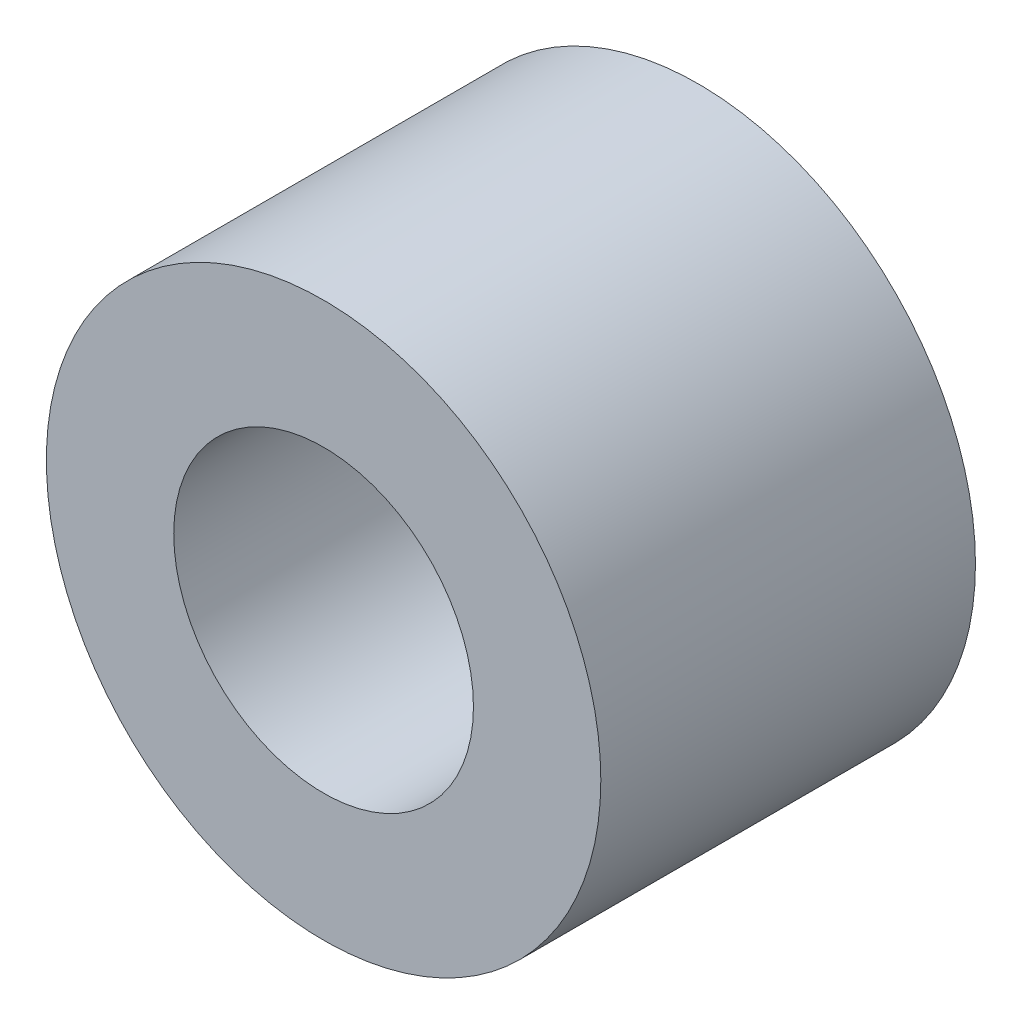
ISO-10303-21;
HEADER;
FILE_DESCRIPTION(('STEP AP214'),'2;1');
FILE_NAME('part.step','',(''),(''),'','','');
FILE_SCHEMA(('AUTOMOTIVE_DESIGN { 1 0 10303 214 1 1 1 1 }'));
ENDSEC;
DATA;
#1=APPLICATION_CONTEXT('core data for automotive mechanical design processes');
#2=APPLICATION_PROTOCOL_DEFINITION('international standard','automotive_design',2000,#1);
#3=PRODUCT_CONTEXT('',#1,'mechanical');
#4=PRODUCT('Part','Part','',(#3));
#5=PRODUCT_RELATED_PRODUCT_CATEGORY('part','',(#4));
#6=PRODUCT_DEFINITION_FORMATION('','',#4);
#7=PRODUCT_DEFINITION_CONTEXT('part definition',#1,'design');
#8=PRODUCT_DEFINITION('design','',#6,#7);
#9=PRODUCT_DEFINITION_SHAPE('','',#8);
#10=(LENGTH_UNIT() NAMED_UNIT(*) SI_UNIT(.MILLI.,.METRE.));
#11=(NAMED_UNIT(*) PLANE_ANGLE_UNIT() SI_UNIT($,.RADIAN.));
#12=(NAMED_UNIT(*) SI_UNIT($,.STERADIAN.) SOLID_ANGLE_UNIT());
#13=UNCERTAINTY_MEASURE_WITH_UNIT(LENGTH_MEASURE(1.E-05),#10,'distance_accuracy_value','');
#14=(GEOMETRIC_REPRESENTATION_CONTEXT(3) GLOBAL_UNCERTAINTY_ASSIGNED_CONTEXT((#13)) GLOBAL_UNIT_ASSIGNED_CONTEXT((#10,
#11,#12)) REPRESENTATION_CONTEXT('',''));
#15=CARTESIAN_POINT('',(0.,0.,0.));
#16=DIRECTION('',(0.,0.,1.));
#17=DIRECTION('',(1.,0.,0.));
#18=AXIS2_PLACEMENT_3D('',#15,#16,#17);
#19=CARTESIAN_POINT('',(0.,0.,2.));
#20=DIRECTION('',(0.,0.,1.));
#21=DIRECTION('',(1.,0.,0.));
#22=AXIS2_PLACEMENT_3D('',#19,#20,#21);
#23=PLANE('',#22);
#24=DIRECTION('',(1.,0.,0.));
#25=VECTOR('',#24,1.);
#26=CARTESIAN_POINT('',(-0.99999999999999,-1.73205080756888,2.));
#27=LINE('',#26,#25);
#28=CARTESIAN_POINT('',(-0.99999999999999,-1.73205080756888,2.));
#29=VERTEX_POINT('',#28);
#30=CARTESIAN_POINT('',(1.00000000000001,-1.73205080756887,2.));
#31=VERTEX_POINT('',#30);
#32=EDGE_CURVE('E111',#29,#31,#27,.T.);
#33=ORIENTED_EDGE('',*,*,#32,.F.);
#34=CARTESIAN_POINT('',(0.,0.,2.));
#35=DIRECTION('',(0.,0.,1.));
#36=DIRECTION('',(1.,0.,0.));
#37=AXIS2_PLACEMENT_3D('',#34,#35,#36);
#38=CIRCLE('',#37,2.);
#39=EDGE_CURVE('E132',#29,#31,#38,.T.);
#40=ORIENTED_EDGE('',*,*,#39,.T.);
#41=EDGE_LOOP('',(#33,#40));
#42=FACE_BOUND('',#41,.T.);
#43=ADVANCED_FACE('F47',(#42),#23,.T.);
#44=DIRECTION('',(0.499999999999995,0.866025403784441,0.));
#45=VECTOR('',#44,1.);
#46=CARTESIAN_POINT('',(1.00000000000001,-1.73205080756887,2.));
#47=LINE('',#46,#45);
#48=CARTESIAN_POINT('',(2.,0.,2.));
#49=VERTEX_POINT('',#48);
#50=EDGE_CURVE('E103',#31,#49,#47,.T.);
#51=ORIENTED_EDGE('',*,*,#50,.F.);
#52=EDGE_CURVE('E124',#31,#49,#38,.T.);
#53=ORIENTED_EDGE('',*,*,#52,.T.);
#54=EDGE_LOOP('',(#51,#53));
#55=FACE_BOUND('',#54,.T.);
#56=ADVANCED_FACE('F123',(#55),#23,.T.);
#57=DIRECTION('',(-0.500000000000005,0.866025403784436,0.));
#58=VECTOR('',#57,1.);
#59=CARTESIAN_POINT('',(2.,0.,2.));
#60=LINE('',#59,#58);
#61=CARTESIAN_POINT('',(0.999999999999989,1.73205080756888,2.));
#62=VERTEX_POINT('',#61);
#63=EDGE_CURVE('E126',#49,#62,#60,.T.);
#64=ORIENTED_EDGE('',*,*,#63,.F.);
#65=EDGE_CURVE('E136',#49,#62,#38,.T.);
#66=ORIENTED_EDGE('',*,*,#65,.T.);
#67=EDGE_LOOP('',(#64,#66));
#68=FACE_BOUND('',#67,.T.);
#69=ADVANCED_FACE('F197',(#68),#23,.T.);
#70=DIRECTION('',(-1.,0.,0.));
#71=VECTOR('',#70,1.);
#72=CARTESIAN_POINT('',(0.999999999999989,1.73205080756888,2.));
#73=LINE('',#72,#71);
#74=CARTESIAN_POINT('',(-1.00000000000001,1.73205080756887,2.));
#75=VERTEX_POINT('',#74);
#76=EDGE_CURVE('E186',#62,#75,#73,.T.);
#77=ORIENTED_EDGE('',*,*,#76,.F.);
#78=EDGE_CURVE('E143',#62,#75,#38,.T.);
#79=ORIENTED_EDGE('',*,*,#78,.T.);
#80=EDGE_LOOP('',(#77,#79));
#81=FACE_BOUND('',#80,.T.);
#82=ADVANCED_FACE('F195',(#81),#23,.T.);
#83=DIRECTION('',(-0.499999999999995,-0.866025403784441,0.));
#84=VECTOR('',#83,1.);
#85=CARTESIAN_POINT('',(-1.00000000000001,1.73205080756887,2.));
#86=LINE('',#85,#84);
#87=CARTESIAN_POINT('',(-2.,0.,2.));
#88=VERTEX_POINT('',#87);
#89=EDGE_CURVE('E62',#75,#88,#86,.T.);
#90=ORIENTED_EDGE('',*,*,#89,.F.);
#91=EDGE_CURVE('E140',#75,#88,#38,.T.);
#92=ORIENTED_EDGE('',*,*,#91,.T.);
#93=EDGE_LOOP('',(#90,#92));
#94=FACE_BOUND('',#93,.T.);
#95=ADVANCED_FACE('F193',(#94),#23,.T.);
#96=CARTESIAN_POINT('',(0.,0.,5.));
#97=DIRECTION('',(0.,0.,-1.));
#98=DIRECTION('',(-1.,0.,0.));
#99=AXIS2_PLACEMENT_3D('',#96,#97,#98);
#100=CYLINDRICAL_SURFACE('',#99,3.7);
#101=CARTESIAN_POINT('',(0.,0.,5.));
#102=DIRECTION('',(0.,0.,1.));
#103=DIRECTION('',(1.,0.,0.));
#104=AXIS2_PLACEMENT_3D('',#101,#102,#103);
#105=CIRCLE('',#104,3.7);
#106=CARTESIAN_POINT('',(3.7,0.,5.));
#107=VERTEX_POINT('',#106);
#108=EDGE_CURVE('E147',#107,#107,#105,.T.);
#109=ORIENTED_EDGE('',*,*,#108,.F.);
#110=EDGE_LOOP('',(#109));
#111=FACE_BOUND('',#110,.T.);
#112=CARTESIAN_POINT('',(0.,0.,0.));
#113=DIRECTION('',(0.,0.,1.));
#114=DIRECTION('',(1.,0.,0.));
#115=AXIS2_PLACEMENT_3D('',#112,#113,#114);
#116=CIRCLE('',#115,3.7);
#117=CARTESIAN_POINT('',(3.7,0.,0.));
#118=VERTEX_POINT('',#117);
#119=EDGE_CURVE('E142',#118,#118,#116,.T.);
#120=ORIENTED_EDGE('',*,*,#119,.T.);
#121=EDGE_LOOP('',(#120));
#122=FACE_BOUND('',#121,.T.);
#123=ADVANCED_FACE('F49',(#111,#122),#100,.T.);
#124=CARTESIAN_POINT('',(0.,0.,5.));
#125=DIRECTION('',(0.,0.,1.));
#126=DIRECTION('',(1.,0.,0.));
#127=AXIS2_PLACEMENT_3D('',#124,#125,#126);
#128=PLANE('',#127);
#129=CARTESIAN_POINT('',(0.,0.,5.));
#130=DIRECTION('',(0.,0.,1.));
#131=DIRECTION('',(1.,0.,0.));
#132=AXIS2_PLACEMENT_3D('',#129,#130,#131);
#133=CIRCLE('',#132,2.);
#134=CARTESIAN_POINT('',(2.,0.,5.));
#135=VERTEX_POINT('',#134);
#136=EDGE_CURVE('E137',#135,#135,#133,.T.);
#137=ORIENTED_EDGE('',*,*,#136,.F.);
#138=EDGE_LOOP('',(#137));
#139=FACE_BOUND('',#138,.T.);
#140=ORIENTED_EDGE('',*,*,#108,.T.);
#141=EDGE_LOOP('',(#140));
#142=FACE_BOUND('',#141,.T.);
#143=ADVANCED_FACE('F223',(#139,#142),#128,.T.);
#144=CARTESIAN_POINT('',(0.,0.,0.));
#145=DIRECTION('',(0.,0.,1.));
#146=DIRECTION('',(1.,0.,0.));
#147=AXIS2_PLACEMENT_3D('',#144,#145,#146);
#148=PLANE('',#147);
#149=DIRECTION('',(0.500000000000005,-0.866025403784436,0.));
#150=VECTOR('',#149,1.);
#151=CARTESIAN_POINT('',(-1.49999999999999,-0.866025403784446,0.));
#152=LINE('',#151,#150);
#153=CARTESIAN_POINT('',(-2.,0.,0.));
#154=VERTEX_POINT('',#153);
#155=CARTESIAN_POINT('',(-0.99999999999999,-1.73205080756888,0.));
#156=VERTEX_POINT('',#155);
#157=EDGE_CURVE('E55',#154,#156,#152,.T.);
#158=ORIENTED_EDGE('',*,*,#157,.T.);
#159=DIRECTION('',(1.,0.,0.));
#160=VECTOR('',#159,1.);
#161=CARTESIAN_POINT('',(0.,-1.73205080756888,0.));
#162=LINE('',#161,#160);
#163=CARTESIAN_POINT('',(1.00000000000001,-1.73205080756887,0.));
#164=VERTEX_POINT('',#163);
#165=EDGE_CURVE('E11',#156,#164,#162,.T.);
#166=ORIENTED_EDGE('',*,*,#165,.T.);
#167=DIRECTION('',(0.499999999999995,0.866025403784442,0.));
#168=VECTOR('',#167,1.);
#169=CARTESIAN_POINT('',(1.5,-0.866025403784429,0.));
#170=LINE('',#169,#168);
#171=CARTESIAN_POINT('',(2.,0.,0.));
#172=VERTEX_POINT('',#171);
#173=EDGE_CURVE('E106',#164,#172,#170,.T.);
#174=ORIENTED_EDGE('',*,*,#173,.T.);
#175=DIRECTION('',(-0.500000000000005,0.866025403784436,0.));
#176=VECTOR('',#175,1.);
#177=CARTESIAN_POINT('',(1.49999999999999,0.866025403784446,0.));
#178=LINE('',#177,#176);
#179=CARTESIAN_POINT('',(0.999999999999989,1.73205080756888,0.));
#180=VERTEX_POINT('',#179);
#181=EDGE_CURVE('E153',#172,#180,#178,.T.);
#182=ORIENTED_EDGE('',*,*,#181,.T.);
#183=DIRECTION('',(-1.,0.,0.));
#184=VECTOR('',#183,1.);
#185=CARTESIAN_POINT('',(0.,1.73205080756888,0.));
#186=LINE('',#185,#184);
#187=CARTESIAN_POINT('',(-1.00000000000001,1.73205080756887,0.));
#188=VERTEX_POINT('',#187);
#189=EDGE_CURVE('E156',#180,#188,#186,.T.);
#190=ORIENTED_EDGE('',*,*,#189,.T.);
#191=DIRECTION('',(-0.499999999999995,-0.866025403784441,0.));
#192=VECTOR('',#191,1.);
#193=CARTESIAN_POINT('',(-1.5,0.866025403784429,0.));
#194=LINE('',#193,#192);
#195=EDGE_CURVE('E159',#188,#154,#194,.T.);
#196=ORIENTED_EDGE('',*,*,#195,.T.);
#197=EDGE_LOOP('',(#158,#166,#174,#182,#190,#196));
#198=FACE_BOUND('',#197,.T.);
#199=ORIENTED_EDGE('',*,*,#119,.F.);
#200=EDGE_LOOP('',(#199));
#201=FACE_BOUND('',#200,.T.);
#202=ADVANCED_FACE('F163',(#198,#201),#148,.F.);
#203=CARTESIAN_POINT('',(0.,0.,2.));
#204=DIRECTION('',(0.,0.,1.));
#205=DIRECTION('',(1.,0.,0.));
#206=AXIS2_PLACEMENT_3D('',#203,#204,#205);
#207=CYLINDRICAL_SURFACE('',#206,2.);
#208=ORIENTED_EDGE('',*,*,#65,.F.);
#209=ORIENTED_EDGE('',*,*,#52,.F.);
#210=ORIENTED_EDGE('',*,*,#39,.F.);
#211=EDGE_CURVE('E139',#88,#29,#38,.T.);
#212=ORIENTED_EDGE('',*,*,#211,.F.);
#213=ORIENTED_EDGE('',*,*,#91,.F.);
#214=ORIENTED_EDGE('',*,*,#78,.F.);
#215=EDGE_LOOP('',(#208,#209,#210,#212,#213,#214));
#216=FACE_BOUND('',#215,.T.);
#217=ORIENTED_EDGE('',*,*,#136,.T.);
#218=EDGE_LOOP('',(#217));
#219=FACE_BOUND('',#218,.T.);
#220=ADVANCED_FACE('F129',(#216,#219),#207,.F.);
#221=DIRECTION('',(0.500000000000005,-0.866025403784436,0.));
#222=VECTOR('',#221,1.);
#223=CARTESIAN_POINT('',(-2.,0.,2.));
#224=LINE('',#223,#222);
#225=EDGE_CURVE('E108',#88,#29,#224,.T.);
#226=ORIENTED_EDGE('',*,*,#225,.F.);
#227=ORIENTED_EDGE('',*,*,#211,.T.);
#228=EDGE_LOOP('',(#226,#227));
#229=FACE_BOUND('',#228,.T.);
#230=ADVANCED_FACE('F203',(#229),#23,.T.);
#231=CARTESIAN_POINT('',(-0.99999999999999,-1.73205080756888,-2.));
#232=DIRECTION('',(0.,-1.,0.));
#233=DIRECTION('',(1.,0.,0.));
#234=AXIS2_PLACEMENT_3D('',#231,#232,#233);
#235=PLANE('',#234);
#236=DIRECTION('',(0.,0.,1.));
#237=VECTOR('',#236,1.);
#238=CARTESIAN_POINT('',(-0.99999999999999,-1.73205080756888,-2.));
#239=LINE('',#238,#237);
#240=EDGE_CURVE('E114',#156,#29,#239,.T.);
#241=ORIENTED_EDGE('',*,*,#240,.T.);
#242=ORIENTED_EDGE('',*,*,#32,.T.);
#243=DIRECTION('',(0.,0.,1.));
#244=VECTOR('',#243,1.);
#245=CARTESIAN_POINT('',(1.00000000000001,-1.73205080756887,-2.));
#246=LINE('',#245,#244);
#247=EDGE_CURVE('E99',#164,#31,#246,.T.);
#248=ORIENTED_EDGE('',*,*,#247,.F.);
#249=ORIENTED_EDGE('',*,*,#165,.F.);
#250=EDGE_LOOP('',(#241,#242,#248,#249));
#251=FACE_BOUND('',#250,.T.);
#252=ADVANCED_FACE('F112',(#251),#235,.F.);
#253=CARTESIAN_POINT('',(-2.,0.,-2.));
#254=DIRECTION('',(-0.866025403784436,-0.500000000000005,0.));
#255=DIRECTION('',(0.500000000000005,-0.866025403784436,0.));
#256=AXIS2_PLACEMENT_3D('',#253,#254,#255);
#257=PLANE('',#256);
#258=DIRECTION('',(0.,0.,1.));
#259=VECTOR('',#258,1.);
#260=CARTESIAN_POINT('',(-2.,0.,-2.));
#261=LINE('',#260,#259);
#262=EDGE_CURVE('E167',#154,#88,#261,.T.);
#263=ORIENTED_EDGE('',*,*,#262,.T.);
#264=ORIENTED_EDGE('',*,*,#225,.T.);
#265=ORIENTED_EDGE('',*,*,#240,.F.);
#266=ORIENTED_EDGE('',*,*,#157,.F.);
#267=EDGE_LOOP('',(#263,#264,#265,#266));
#268=FACE_BOUND('',#267,.T.);
#269=ADVANCED_FACE('F166',(#268),#257,.F.);
#270=CARTESIAN_POINT('',(-1.00000000000001,1.73205080756887,-2.));
#271=DIRECTION('',(-0.866025403784441,0.499999999999995,0.));
#272=DIRECTION('',(-0.499999999999995,-0.866025403784441,0.));
#273=AXIS2_PLACEMENT_3D('',#270,#271,#272);
#274=PLANE('',#273);
#275=DIRECTION('',(0.,0.,1.));
#276=VECTOR('',#275,1.);
#277=CARTESIAN_POINT('',(-1.00000000000001,1.73205080756887,-2.));
#278=LINE('',#277,#276);
#279=EDGE_CURVE('E171',#188,#75,#278,.T.);
#280=ORIENTED_EDGE('',*,*,#279,.T.);
#281=ORIENTED_EDGE('',*,*,#89,.T.);
#282=ORIENTED_EDGE('',*,*,#262,.F.);
#283=ORIENTED_EDGE('',*,*,#195,.F.);
#284=EDGE_LOOP('',(#280,#281,#282,#283));
#285=FACE_BOUND('',#284,.T.);
#286=ADVANCED_FACE('F169',(#285),#274,.F.);
#287=CARTESIAN_POINT('',(0.999999999999989,1.73205080756888,-2.));
#288=DIRECTION('',(0.,1.,0.));
#289=DIRECTION('',(-1.,0.,0.));
#290=AXIS2_PLACEMENT_3D('',#287,#288,#289);
#291=PLANE('',#290);
#292=DIRECTION('',(0.,0.,1.));
#293=VECTOR('',#292,1.);
#294=CARTESIAN_POINT('',(0.999999999999989,1.73205080756888,-2.));
#295=LINE('',#294,#293);
#296=EDGE_CURVE('E174',#180,#62,#295,.T.);
#297=ORIENTED_EDGE('',*,*,#296,.T.);
#298=ORIENTED_EDGE('',*,*,#76,.T.);
#299=ORIENTED_EDGE('',*,*,#279,.F.);
#300=ORIENTED_EDGE('',*,*,#189,.F.);
#301=EDGE_LOOP('',(#297,#298,#299,#300));
#302=FACE_BOUND('',#301,.T.);
#303=ADVANCED_FACE('F184',(#302),#291,.F.);
#304=CARTESIAN_POINT('',(2.,0.,-2.));
#305=DIRECTION('',(0.866025403784436,0.500000000000005,0.));
#306=DIRECTION('',(-0.500000000000005,0.866025403784436,0.));
#307=AXIS2_PLACEMENT_3D('',#304,#305,#306);
#308=PLANE('',#307);
#309=DIRECTION('',(0.,0.,1.));
#310=VECTOR('',#309,1.);
#311=CARTESIAN_POINT('',(2.,0.,-2.));
#312=LINE('',#311,#310);
#313=EDGE_CURVE('E70',#172,#49,#312,.T.);
#314=ORIENTED_EDGE('',*,*,#313,.T.);
#315=ORIENTED_EDGE('',*,*,#63,.T.);
#316=ORIENTED_EDGE('',*,*,#296,.F.);
#317=ORIENTED_EDGE('',*,*,#181,.F.);
#318=EDGE_LOOP('',(#314,#315,#316,#317));
#319=FACE_BOUND('',#318,.T.);
#320=ADVANCED_FACE('F180',(#319),#308,.F.);
#321=CARTESIAN_POINT('',(1.00000000000001,-1.73205080756887,-2.));
#322=DIRECTION('',(0.866025403784441,-0.499999999999995,0.));
#323=DIRECTION('',(0.499999999999995,0.866025403784442,0.));
#324=AXIS2_PLACEMENT_3D('',#321,#322,#323);
#325=PLANE('',#324);
#326=ORIENTED_EDGE('',*,*,#247,.T.);
#327=ORIENTED_EDGE('',*,*,#50,.T.);
#328=ORIENTED_EDGE('',*,*,#313,.F.);
#329=ORIENTED_EDGE('',*,*,#173,.F.);
#330=EDGE_LOOP('',(#326,#327,#328,#329));
#331=FACE_BOUND('',#330,.T.);
#332=ADVANCED_FACE('F101',(#331),#325,.F.);
#333=CLOSED_SHELL('',(#43,#56,#69,#82,#95,#123,#143,#202,#220,#230,#252,#269,#286,#303,#320,#332));
#334=MANIFOLD_SOLID_BREP('B2',#333);
#335=ADVANCED_BREP_SHAPE_REPRESENTATION('',(#18,#334),#14);
#336=SHAPE_DEFINITION_REPRESENTATION(#9,#335);
ENDSEC;
END-ISO-10303-21;
